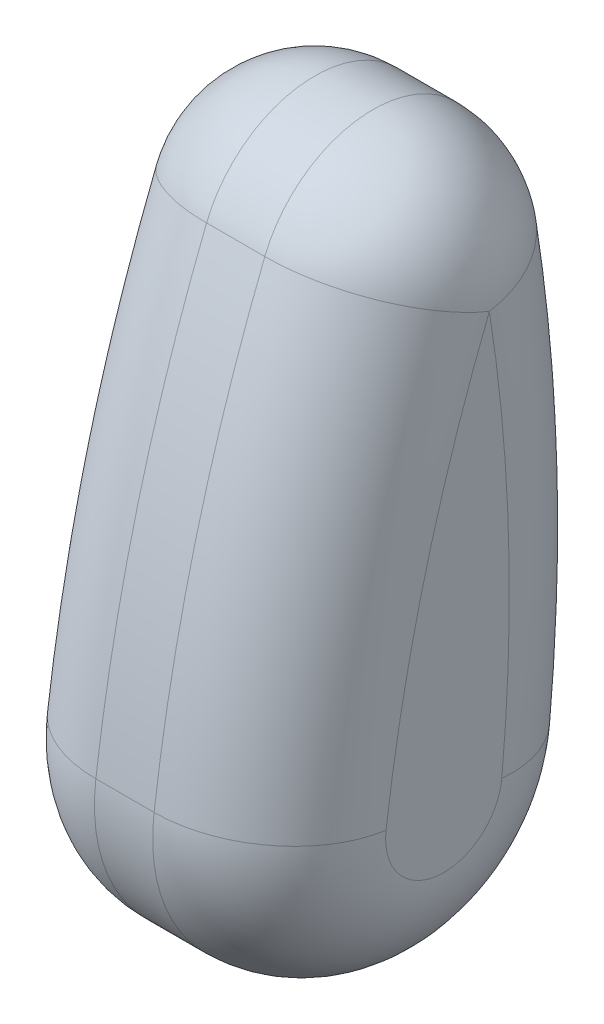
ISO-10303-21;
HEADER;
FILE_DESCRIPTION(('STEP AP214'),'2;1');
FILE_NAME('part.step','',(''),(''),'','','');
FILE_SCHEMA(('AUTOMOTIVE_DESIGN { 1 0 10303 214 1 1 1 1 }'));
ENDSEC;
DATA;
#1=APPLICATION_CONTEXT('core data for automotive mechanical design processes');
#2=APPLICATION_PROTOCOL_DEFINITION('international standard','automotive_design',2000,#1);
#3=PRODUCT_CONTEXT('',#1,'mechanical');
#4=PRODUCT('Part','Part','',(#3));
#5=PRODUCT_RELATED_PRODUCT_CATEGORY('part','',(#4));
#6=PRODUCT_DEFINITION_FORMATION('','',#4);
#7=PRODUCT_DEFINITION_CONTEXT('part definition',#1,'design');
#8=PRODUCT_DEFINITION('design','',#6,#7);
#9=PRODUCT_DEFINITION_SHAPE('','',#8);
#10=(LENGTH_UNIT() NAMED_UNIT(*) SI_UNIT(.MILLI.,.METRE.));
#11=(NAMED_UNIT(*) PLANE_ANGLE_UNIT() SI_UNIT($,.RADIAN.));
#12=(NAMED_UNIT(*) SI_UNIT($,.STERADIAN.) SOLID_ANGLE_UNIT());
#13=UNCERTAINTY_MEASURE_WITH_UNIT(LENGTH_MEASURE(1.E-05),#10,'distance_accuracy_value','');
#14=(GEOMETRIC_REPRESENTATION_CONTEXT(3) GLOBAL_UNCERTAINTY_ASSIGNED_CONTEXT((#13)) GLOBAL_UNIT_ASSIGNED_CONTEXT((#10,
#11,#12)) REPRESENTATION_CONTEXT('',''));
#15=CARTESIAN_POINT('',(0.,0.,0.));
#16=DIRECTION('',(0.,0.,1.));
#17=DIRECTION('',(1.,0.,0.));
#18=AXIS2_PLACEMENT_3D('',#15,#16,#17);
#19=CARTESIAN_POINT('',(63.5,105.260529814736,-686.134802304538));
#20=DIRECTION('',(-1.,0.,0.));
#21=DIRECTION('',(0.,0.,1.));
#22=AXIS2_PLACEMENT_3D('',#19,#20,#21);
#23=CYLINDRICAL_SURFACE('',#22,762.);
#24=DIRECTION('',(-1.,0.,0.));
#25=VECTOR('',#24,1.);
#26=CARTESIAN_POINT('',(63.5,388.31512238001,21.3424748059756));
#27=LINE('',#26,#25);
#28=CARTESIAN_POINT('',(12.7,388.31512238001,21.3424748059756));
#29=VERTEX_POINT('',#28);
#30=CARTESIAN_POINT('',(-12.7,388.31512238001,21.3424748059756));
#31=VERTEX_POINT('',#30);
#32=EDGE_CURVE('E138',#29,#31,#27,.T.);
#33=ORIENTED_EDGE('',*,*,#32,.T.);
#34=CARTESIAN_POINT('',(-12.7,105.260529814736,-686.134802304538));
#35=DIRECTION('',(-1.,0.,0.));
#36=DIRECTION('',(0.,0.,1.));
#37=AXIS2_PLACEMENT_3D('',#34,#35,#36);
#38=CIRCLE('',#37,762.);
#39=CARTESIAN_POINT('',(-12.7,202.482225769918,69.6376117432345));
#40=VERTEX_POINT('',#39);
#41=EDGE_CURVE('E145',#31,#40,#38,.F.);
#42=ORIENTED_EDGE('',*,*,#41,.T.);
#43=DIRECTION('',(-1.,0.,0.));
#44=VECTOR('',#43,1.);
#45=CARTESIAN_POINT('',(63.5,202.482225769918,69.6376117432345));
#46=LINE('',#45,#44);
#47=CARTESIAN_POINT('',(12.7,202.482225769918,69.6376117432345));
#48=VERTEX_POINT('',#47);
#49=EDGE_CURVE('E116',#48,#40,#46,.T.);
#50=ORIENTED_EDGE('',*,*,#49,.F.);
#51=CARTESIAN_POINT('',(12.7,105.260529814736,-686.134802304538));
#52=DIRECTION('',(-1.,0.,0.));
#53=DIRECTION('',(0.,0.,1.));
#54=AXIS2_PLACEMENT_3D('',#51,#52,#53);
#55=CIRCLE('',#54,762.);
#56=EDGE_CURVE('E147',#48,#29,#55,.T.);
#57=ORIENTED_EDGE('',*,*,#56,.T.);
#58=EDGE_LOOP('',(#33,#42,#50,#57));
#59=FACE_BOUND('',#58,.T.);
#60=ADVANCED_FACE('F35',(#59),#23,.T.);
#61=CARTESIAN_POINT('',(63.5,192.760056174399,-5.93962966154271));
#62=DIRECTION('',(-1.,0.,0.));
#63=DIRECTION('',(0.,0.,1.));
#64=AXIS2_PLACEMENT_3D('',#61,#62,#63);
#65=CYLINDRICAL_SURFACE('',#64,76.2);
#66=ORIENTED_EDGE('',*,*,#49,.T.);
#67=CARTESIAN_POINT('',(-12.7,192.760056174399,-5.93962966154271));
#68=DIRECTION('',(-1.,0.,0.));
#69=DIRECTION('',(0.,0.,1.));
#70=AXIS2_PLACEMENT_3D('',#67,#68,#69);
#71=CIRCLE('',#70,76.2);
#72=CARTESIAN_POINT('',(-12.7,185.441760865066,-81.7873887172023));
#73=VERTEX_POINT('',#72);
#74=EDGE_CURVE('E115',#40,#73,#71,.F.);
#75=ORIENTED_EDGE('',*,*,#74,.T.);
#76=DIRECTION('',(-1.,0.,0.));
#77=VECTOR('',#76,1.);
#78=CARTESIAN_POINT('',(63.5,185.441760865066,-81.7873887172023));
#79=LINE('',#78,#77);
#80=CARTESIAN_POINT('',(12.7,185.441760865066,-81.7873887172023));
#81=VERTEX_POINT('',#80);
#82=EDGE_CURVE('E97',#81,#73,#79,.T.);
#83=ORIENTED_EDGE('',*,*,#82,.F.);
#84=CARTESIAN_POINT('',(12.7,192.760056174399,-5.93962966154271));
#85=DIRECTION('',(-1.,0.,0.));
#86=DIRECTION('',(0.,0.,1.));
#87=AXIS2_PLACEMENT_3D('',#84,#85,#86);
#88=CIRCLE('',#87,76.2);
#89=EDGE_CURVE('E112',#81,#48,#88,.T.);
#90=ORIENTED_EDGE('',*,*,#89,.T.);
#91=EDGE_LOOP('',(#66,#75,#83,#90));
#92=FACE_BOUND('',#91,.T.);
#93=ADVANCED_FACE('F111',(#92),#65,.T.);
#94=CARTESIAN_POINT('',(63.5,258.624713958398,676.690201839394));
#95=DIRECTION('',(-1.,0.,0.));
#96=DIRECTION('',(0.,0.,1.));
#97=AXIS2_PLACEMENT_3D('',#94,#95,#96);
#98=CYLINDRICAL_SURFACE('',#97,762.);
#99=ORIENTED_EDGE('',*,*,#82,.T.);
#100=CARTESIAN_POINT('',(-12.7,258.624713958398,676.690201839394));
#101=DIRECTION('',(-1.,0.,0.));
#102=DIRECTION('',(0.,0.,1.));
#103=AXIS2_PLACEMENT_3D('',#100,#101,#102);
#104=CIRCLE('',#103,762.);
#105=CARTESIAN_POINT('',(-12.7,377.36053779832,-76.0021683471621));
#106=VERTEX_POINT('',#105);
#107=EDGE_CURVE('E104',#73,#106,#104,.F.);
#108=ORIENTED_EDGE('',*,*,#107,.T.);
#109=DIRECTION('',(-1.,0.,0.));
#110=VECTOR('',#109,1.);
#111=CARTESIAN_POINT('',(63.5,377.36053779832,-76.0021683471621));
#112=LINE('',#111,#110);
#113=CARTESIAN_POINT('',(12.7,377.36053779832,-76.0021683471621));
#114=VERTEX_POINT('',#113);
#115=EDGE_CURVE('E99',#114,#106,#112,.T.);
#116=ORIENTED_EDGE('',*,*,#115,.F.);
#117=CARTESIAN_POINT('',(12.7,258.624713958398,676.690201839394));
#118=DIRECTION('',(-1.,0.,0.));
#119=DIRECTION('',(0.,0.,1.));
#120=AXIS2_PLACEMENT_3D('',#117,#118,#119);
#121=CIRCLE('',#120,762.);
#122=EDGE_CURVE('E94',#114,#81,#121,.T.);
#123=ORIENTED_EDGE('',*,*,#122,.T.);
#124=EDGE_LOOP('',(#99,#108,#116,#123));
#125=FACE_BOUND('',#124,.T.);
#126=ADVANCED_FACE('F96',(#125),#98,.T.);
#127=CARTESIAN_POINT('',(63.5,369.444816208991,-25.8226770013918));
#128=DIRECTION('',(-1.,0.,0.));
#129=DIRECTION('',(0.,0.,1.));
#130=AXIS2_PLACEMENT_3D('',#127,#128,#129);
#131=CYLINDRICAL_SURFACE('',#130,50.7999999999998);
#132=ORIENTED_EDGE('',*,*,#115,.T.);
#133=CARTESIAN_POINT('',(-12.7,369.444816208991,-25.8226770013918));
#134=DIRECTION('',(-1.,0.,0.));
#135=DIRECTION('',(0.,0.,1.));
#136=AXIS2_PLACEMENT_3D('',#133,#134,#135);
#137=CIRCLE('',#136,50.7999999999998);
#138=EDGE_CURVE('E149',#106,#31,#137,.F.);
#139=ORIENTED_EDGE('',*,*,#138,.T.);
#140=ORIENTED_EDGE('',*,*,#32,.F.);
#141=CARTESIAN_POINT('',(12.7,369.444816208991,-25.8226770013918));
#142=DIRECTION('',(-1.,0.,0.));
#143=DIRECTION('',(0.,0.,1.));
#144=AXIS2_PLACEMENT_3D('',#141,#142,#143);
#145=CIRCLE('',#144,50.7999999999998);
#146=EDGE_CURVE('E151',#29,#114,#145,.T.);
#147=ORIENTED_EDGE('',*,*,#146,.T.);
#148=EDGE_LOOP('',(#132,#139,#140,#147));
#149=FACE_BOUND('',#148,.T.);
#150=ADVANCED_FACE('F186',(#149),#131,.T.);
#151=CARTESIAN_POINT('',(63.5,237.352673011864,-355.978739652965));
#152=DIRECTION('',(-1.,0.,0.));
#153=DIRECTION('',(0.,0.,1.));
#154=AXIS2_PLACEMENT_3D('',#151,#152,#153);
#155=PLANE('',#154);
#156=CARTESIAN_POINT('',(63.5,192.760056174399,-5.93962966154271));
#157=DIRECTION('',(-1.,0.,0.));
#158=DIRECTION('',(0.,0.,1.));
#159=AXIS2_PLACEMENT_3D('',#156,#157,#158);
#160=CIRCLE('',#159,25.4);
#161=CARTESIAN_POINT('',(63.5,196.000779372905,19.2527841400497));
#162=VERTEX_POINT('',#161);
#163=CARTESIAN_POINT('',(63.5,190.320624404622,-31.2222160134292));
#164=VERTEX_POINT('',#163);
#165=EDGE_CURVE('E44',#162,#164,#160,.F.);
#166=ORIENTED_EDGE('',*,*,#165,.T.);
#167=CARTESIAN_POINT('',(63.5,258.624713958398,676.690201839394));
#168=DIRECTION('',(-1.,0.,0.));
#169=DIRECTION('',(0.,0.,1.));
#170=AXIS2_PLACEMENT_3D('',#167,#168,#169);
#171=CIRCLE('',#170,711.2);
#172=CARTESIAN_POINT('',(63.5,369.444816208991,-25.8226770013919));
#173=VERTEX_POINT('',#172);
#174=EDGE_CURVE('E11',#164,#173,#171,.F.);
#175=ORIENTED_EDGE('',*,*,#174,.T.);
#176=CARTESIAN_POINT('',(63.5,105.260529814736,-686.134802304538));
#177=DIRECTION('',(-1.,0.,0.));
#178=DIRECTION('',(0.,0.,1.));
#179=AXIS2_PLACEMENT_3D('',#176,#177,#178);
#180=CIRCLE('',#179,711.2);
#181=EDGE_CURVE('E54',#173,#162,#180,.F.);
#182=ORIENTED_EDGE('',*,*,#181,.T.);
#183=EDGE_LOOP('',(#166,#175,#182));
#184=FACE_BOUND('',#183,.T.);
#185=ADVANCED_FACE('F191',(#184),#155,.F.);
#186=CARTESIAN_POINT('',(-63.5,237.352673011864,-355.978739652965));
#187=DIRECTION('',(-1.,0.,0.));
#188=DIRECTION('',(0.,0.,1.));
#189=AXIS2_PLACEMENT_3D('',#186,#187,#188);
#190=PLANE('',#189);
#191=CARTESIAN_POINT('',(-63.5,258.624713958398,676.690201839394));
#192=DIRECTION('',(-1.,0.,0.));
#193=DIRECTION('',(0.,0.,1.));
#194=AXIS2_PLACEMENT_3D('',#191,#192,#193);
#195=CIRCLE('',#194,711.2);
#196=CARTESIAN_POINT('',(-63.5,369.444816208991,-25.8226770013919));
#197=VERTEX_POINT('',#196);
#198=CARTESIAN_POINT('',(-63.5,190.320624404622,-31.2222160134292));
#199=VERTEX_POINT('',#198);
#200=EDGE_CURVE('E156',#197,#199,#195,.T.);
#201=ORIENTED_EDGE('',*,*,#200,.T.);
#202=CARTESIAN_POINT('',(-63.5,192.760056174399,-5.93962966154271));
#203=DIRECTION('',(-1.,0.,0.));
#204=DIRECTION('',(0.,0.,1.));
#205=AXIS2_PLACEMENT_3D('',#202,#203,#204);
#206=CIRCLE('',#205,25.4);
#207=CARTESIAN_POINT('',(-63.5,196.000779372905,19.2527841400497));
#208=VERTEX_POINT('',#207);
#209=EDGE_CURVE('E105',#199,#208,#206,.T.);
#210=ORIENTED_EDGE('',*,*,#209,.T.);
#211=CARTESIAN_POINT('',(-63.5,105.260529814736,-686.134802304538));
#212=DIRECTION('',(-1.,0.,0.));
#213=DIRECTION('',(0.,0.,1.));
#214=AXIS2_PLACEMENT_3D('',#211,#212,#213);
#215=CIRCLE('',#214,711.2);
#216=EDGE_CURVE('E158',#208,#197,#215,.T.);
#217=ORIENTED_EDGE('',*,*,#216,.T.);
#218=EDGE_LOOP('',(#201,#210,#217));
#219=FACE_BOUND('',#218,.T.);
#220=ADVANCED_FACE('F193',(#219),#190,.T.);
#221=CARTESIAN_POINT('',(-12.7,369.444816208991,-25.8226770013918));
#222=DIRECTION('',(0.,0.,1.));
#223=DIRECTION('',(1.,0.,0.));
#224=AXIS2_PLACEMENT_3D('',#221,#222,#223);
#225=SPHERICAL_SURFACE('',#224,50.8);
#226=CARTESIAN_POINT('',(-12.7,369.444816208991,-25.8226770013918));
#227=DIRECTION('',(0.,-0.987785262712015,-0.155821291128509));
#228=DIRECTION('',(0.,0.155821291128509,-0.987785262712015));
#229=AXIS2_PLACEMENT_3D('',#226,#227,#228);
#230=CIRCLE('',#229,50.8);
#231=EDGE_CURVE('E139',#197,#106,#230,.T.);
#232=ORIENTED_EDGE('',*,*,#231,.F.);
#233=CARTESIAN_POINT('',(-12.7,369.444816208991,-25.822677001392));
#234=DIRECTION('',(0.,-0.928447870223771,0.371462719901935));
#235=DIRECTION('',(0.,-0.371462719901935,-0.928447870223771));
#236=AXIS2_PLACEMENT_3D('',#233,#234,#235);
#237=CIRCLE('',#236,50.8);
#238=EDGE_CURVE('E135',#31,#197,#237,.T.);
#239=ORIENTED_EDGE('',*,*,#238,.F.);
#240=ORIENTED_EDGE('',*,*,#138,.F.);
#241=EDGE_LOOP('',(#232,#239,#240));
#242=FACE_BOUND('',#241,.T.);
#243=ADVANCED_FACE('F173',(#242),#225,.T.);
#244=CARTESIAN_POINT('',(-12.7,105.260529814736,-686.134802304538));
#245=DIRECTION('',(-1.,0.,0.));
#246=DIRECTION('',(0.,0.,1.));
#247=AXIS2_PLACEMENT_3D('',#244,#245,#246);
#248=TOROIDAL_SURFACE('',#247,711.2,50.8);
#249=ORIENTED_EDGE('',*,*,#238,.T.);
#250=ORIENTED_EDGE('',*,*,#216,.F.);
#251=CARTESIAN_POINT('',(-12.7,196.000779372905,19.2527841400496));
#252=DIRECTION('',(0.,-0.991827315023324,0.127587527500238));
#253=DIRECTION('',(0.,-0.127587527500238,-0.991827315023324));
#254=AXIS2_PLACEMENT_3D('',#251,#252,#253);
#255=CIRCLE('',#254,50.8);
#256=EDGE_CURVE('E127',#40,#208,#255,.T.);
#257=ORIENTED_EDGE('',*,*,#256,.F.);
#258=ORIENTED_EDGE('',*,*,#41,.F.);
#259=EDGE_LOOP('',(#249,#250,#257,#258));
#260=FACE_BOUND('',#259,.T.);
#261=ADVANCED_FACE('F178',(#260),#248,.T.);
#262=CARTESIAN_POINT('',(-12.7,258.624713958398,676.690201839394));
#263=DIRECTION('',(-1.,0.,0.));
#264=DIRECTION('',(0.,0.,1.));
#265=AXIS2_PLACEMENT_3D('',#262,#263,#264);
#266=TOROIDAL_SURFACE('',#265,711.2,50.8);
#267=ORIENTED_EDGE('',*,*,#231,.T.);
#268=ORIENTED_EDGE('',*,*,#107,.F.);
#269=CARTESIAN_POINT('',(-12.7,190.320624404622,-31.2222160134292));
#270=DIRECTION('',(0.,-0.995377415428603,0.0960406208573905));
#271=DIRECTION('',(0.,-0.0960406208573906,-0.995377415428604));
#272=AXIS2_PLACEMENT_3D('',#269,#270,#271);
#273=CIRCLE('',#272,50.8);
#274=EDGE_CURVE('E126',#199,#73,#273,.T.);
#275=ORIENTED_EDGE('',*,*,#274,.F.);
#276=ORIENTED_EDGE('',*,*,#200,.F.);
#277=EDGE_LOOP('',(#267,#268,#275,#276));
#278=FACE_BOUND('',#277,.T.);
#279=ADVANCED_FACE('F185',(#278),#266,.T.);
#280=CARTESIAN_POINT('',(-12.7,192.760056174399,-5.93962966154271));
#281=DIRECTION('',(-1.,0.,0.));
#282=DIRECTION('',(0.,0.,1.));
#283=AXIS2_PLACEMENT_3D('',#280,#281,#282);
#284=DEGENERATE_TOROIDAL_SURFACE('',#283,25.4,50.8,.T.);
#285=ORIENTED_EDGE('',*,*,#256,.T.);
#286=ORIENTED_EDGE('',*,*,#209,.F.);
#287=ORIENTED_EDGE('',*,*,#274,.T.);
#288=ORIENTED_EDGE('',*,*,#74,.F.);
#289=EDGE_LOOP('',(#285,#286,#287,#288));
#290=FACE_BOUND('',#289,.T.);
#291=ADVANCED_FACE('F181',(#290),#284,.T.);
#292=CARTESIAN_POINT('',(12.7,192.760056174399,-5.93962966154271));
#293=DIRECTION('',(-1.,0.,0.));
#294=DIRECTION('',(0.,0.,1.));
#295=AXIS2_PLACEMENT_3D('',#292,#293,#294);
#296=DEGENERATE_TOROIDAL_SURFACE('',#295,25.4,50.8,.T.);
#297=CARTESIAN_POINT('',(12.7,196.000779372905,19.2527841400497));
#298=DIRECTION('',(0.,0.991827315023324,-0.127587527500239));
#299=DIRECTION('',(0.,0.127587527500239,0.991827315023324));
#300=AXIS2_PLACEMENT_3D('',#297,#298,#299);
#301=CIRCLE('',#300,50.8);
#302=EDGE_CURVE('E122',#48,#162,#301,.T.);
#303=ORIENTED_EDGE('',*,*,#302,.F.);
#304=ORIENTED_EDGE('',*,*,#89,.F.);
#305=CARTESIAN_POINT('',(12.7,190.320624404622,-31.2222160134292));
#306=DIRECTION('',(0.,0.995377415428603,-0.0960406208573905));
#307=DIRECTION('',(0.,0.0960406208573906,0.995377415428604));
#308=AXIS2_PLACEMENT_3D('',#305,#306,#307);
#309=CIRCLE('',#308,50.8);
#310=EDGE_CURVE('E39',#164,#81,#309,.T.);
#311=ORIENTED_EDGE('',*,*,#310,.F.);
#312=ORIENTED_EDGE('',*,*,#165,.F.);
#313=EDGE_LOOP('',(#303,#304,#311,#312));
#314=FACE_BOUND('',#313,.T.);
#315=ADVANCED_FACE('F37',(#314),#296,.T.);
#316=CARTESIAN_POINT('',(12.7,258.624713958398,676.690201839394));
#317=DIRECTION('',(-1.,0.,0.));
#318=DIRECTION('',(0.,0.,1.));
#319=AXIS2_PLACEMENT_3D('',#316,#317,#318);
#320=TOROIDAL_SURFACE('',#319,711.2,50.8);
#321=ORIENTED_EDGE('',*,*,#310,.T.);
#322=ORIENTED_EDGE('',*,*,#122,.F.);
#323=CARTESIAN_POINT('',(12.7,369.444816208991,-25.8226770013917));
#324=DIRECTION('',(0.,0.987785262712015,0.155821291128508));
#325=DIRECTION('',(0.,-0.155821291128508,0.987785262712015));
#326=AXIS2_PLACEMENT_3D('',#323,#324,#325);
#327=CIRCLE('',#326,50.8);
#328=EDGE_CURVE('E129',#173,#114,#327,.T.);
#329=ORIENTED_EDGE('',*,*,#328,.F.);
#330=ORIENTED_EDGE('',*,*,#174,.F.);
#331=EDGE_LOOP('',(#321,#322,#329,#330));
#332=FACE_BOUND('',#331,.T.);
#333=ADVANCED_FACE('F125',(#332),#320,.T.);
#334=CARTESIAN_POINT('',(12.7,105.260529814736,-686.134802304538));
#335=DIRECTION('',(-1.,0.,0.));
#336=DIRECTION('',(0.,0.,1.));
#337=AXIS2_PLACEMENT_3D('',#334,#335,#336);
#338=TOROIDAL_SURFACE('',#337,711.2,50.8);
#339=ORIENTED_EDGE('',*,*,#302,.T.);
#340=ORIENTED_EDGE('',*,*,#181,.F.);
#341=CARTESIAN_POINT('',(12.7,369.444816208991,-25.822677001392));
#342=DIRECTION('',(0.,0.928447870223771,-0.371462719901934));
#343=DIRECTION('',(0.,0.371462719901934,0.928447870223772));
#344=AXIS2_PLACEMENT_3D('',#341,#342,#343);
#345=CIRCLE('',#344,50.8);
#346=EDGE_CURVE('E131',#29,#173,#345,.T.);
#347=ORIENTED_EDGE('',*,*,#346,.F.);
#348=ORIENTED_EDGE('',*,*,#56,.F.);
#349=EDGE_LOOP('',(#339,#340,#347,#348));
#350=FACE_BOUND('',#349,.T.);
#351=ADVANCED_FACE('F190',(#350),#338,.T.);
#352=CARTESIAN_POINT('',(12.7,369.444816208991,-25.8226770013918));
#353=DIRECTION('',(0.,0.,1.));
#354=DIRECTION('',(1.,0.,0.));
#355=AXIS2_PLACEMENT_3D('',#352,#353,#354);
#356=SPHERICAL_SURFACE('',#355,50.8);
#357=ORIENTED_EDGE('',*,*,#328,.T.);
#358=ORIENTED_EDGE('',*,*,#146,.F.);
#359=ORIENTED_EDGE('',*,*,#346,.T.);
#360=EDGE_LOOP('',(#357,#358,#359));
#361=FACE_BOUND('',#360,.T.);
#362=ADVANCED_FACE('F189',(#361),#356,.T.);
#363=CLOSED_SHELL('',(#60,#93,#126,#150,#185,#220,#243,#261,#279,#291,#315,#333,#351,#362));
#364=MANIFOLD_SOLID_BREP('B2',#363);
#365=ADVANCED_BREP_SHAPE_REPRESENTATION('',(#18,#364),#14);
#366=SHAPE_DEFINITION_REPRESENTATION(#9,#365);
ENDSEC;
END-ISO-10303-21;
